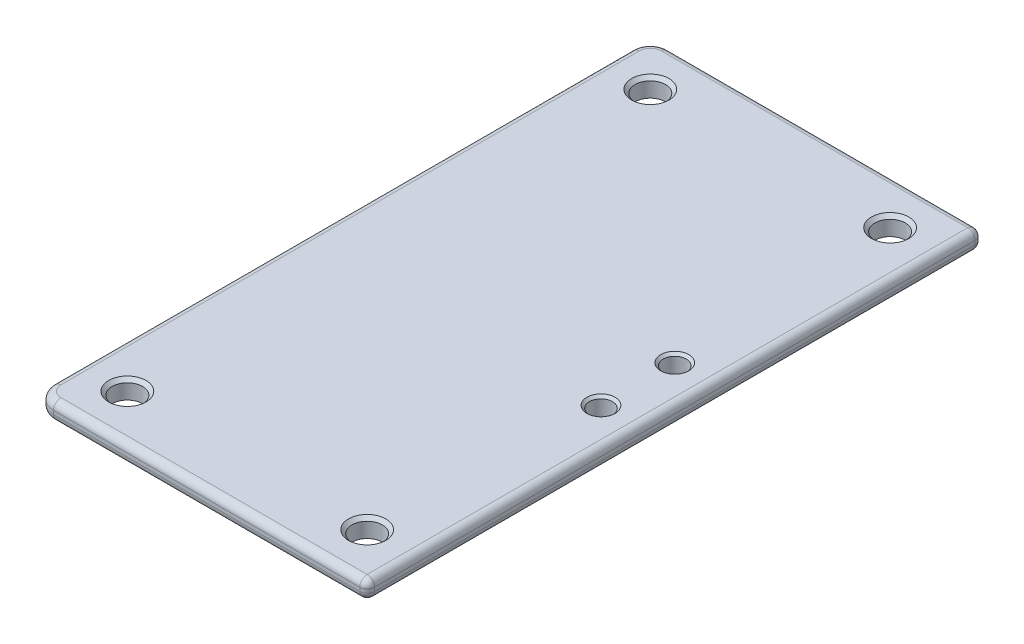
ISO-10303-21;
HEADER;
FILE_DESCRIPTION(('STEP AP214'),'2;1');
FILE_NAME('part.step','',(''),(''),'','','');
FILE_SCHEMA(('AUTOMOTIVE_DESIGN { 1 0 10303 214 1 1 1 1 }'));
ENDSEC;
DATA;
#1=APPLICATION_CONTEXT('core data for automotive mechanical design processes');
#2=APPLICATION_PROTOCOL_DEFINITION('international standard','automotive_design',2000,#1);
#3=PRODUCT_CONTEXT('',#1,'mechanical');
#4=PRODUCT('Part','Part','',(#3));
#5=PRODUCT_RELATED_PRODUCT_CATEGORY('part','',(#4));
#6=PRODUCT_DEFINITION_FORMATION('','',#4);
#7=PRODUCT_DEFINITION_CONTEXT('part definition',#1,'design');
#8=PRODUCT_DEFINITION('design','',#6,#7);
#9=PRODUCT_DEFINITION_SHAPE('','',#8);
#10=(LENGTH_UNIT() NAMED_UNIT(*) SI_UNIT(.MILLI.,.METRE.));
#11=(NAMED_UNIT(*) PLANE_ANGLE_UNIT() SI_UNIT($,.RADIAN.));
#12=(NAMED_UNIT(*) SI_UNIT($,.STERADIAN.) SOLID_ANGLE_UNIT());
#13=UNCERTAINTY_MEASURE_WITH_UNIT(LENGTH_MEASURE(1.E-05),#10,'distance_accuracy_value','');
#14=(GEOMETRIC_REPRESENTATION_CONTEXT(3) GLOBAL_UNCERTAINTY_ASSIGNED_CONTEXT((#13)) GLOBAL_UNIT_ASSIGNED_CONTEXT((#10,
#11,#12)) REPRESENTATION_CONTEXT('',''));
#15=CARTESIAN_POINT('',(0.,0.,0.));
#16=DIRECTION('',(0.,0.,1.));
#17=DIRECTION('',(1.,0.,0.));
#18=AXIS2_PLACEMENT_3D('',#15,#16,#17);
#19=CARTESIAN_POINT('',(-18.,2.,33.35));
#20=DIRECTION('',(0.,0.,-1.));
#21=DIRECTION('',(-1.,0.,0.));
#22=AXIS2_PLACEMENT_3D('',#19,#20,#21);
#23=PLANE('',#22);
#24=DIRECTION('',(0.,-1.,0.));
#25=VECTOR('',#24,1.);
#26=CARTESIAN_POINT('',(-16.,0.,33.35));
#27=LINE('',#26,#25);
#28=CARTESIAN_POINT('',(-16.,1.2,33.35));
#29=VERTEX_POINT('',#28);
#30=CARTESIAN_POINT('',(-16.,0.8,33.35));
#31=VERTEX_POINT('',#30);
#32=EDGE_CURVE('E330',#29,#31,#27,.T.);
#33=ORIENTED_EDGE('',*,*,#32,.T.);
#34=DIRECTION('',(1.,0.,0.));
#35=VECTOR('',#34,1.);
#36=CARTESIAN_POINT('',(-18.,0.8,33.35));
#37=LINE('',#36,#35);
#38=CARTESIAN_POINT('',(17.2,0.8,33.35));
#39=VERTEX_POINT('',#38);
#40=EDGE_CURVE('E218',#31,#39,#37,.T.);
#41=ORIENTED_EDGE('',*,*,#40,.T.);
#42=DIRECTION('',(0.,-1.,0.));
#43=VECTOR('',#42,1.);
#44=CARTESIAN_POINT('',(17.2,2.,33.35));
#45=LINE('',#44,#43);
#46=CARTESIAN_POINT('',(17.2,1.2,33.35));
#47=VERTEX_POINT('',#46);
#48=EDGE_CURVE('E214',#39,#47,#45,.F.);
#49=ORIENTED_EDGE('',*,*,#48,.T.);
#50=DIRECTION('',(1.,0.,0.));
#51=VECTOR('',#50,1.);
#52=CARTESIAN_POINT('',(-16.,1.2,33.35));
#53=LINE('',#52,#51);
#54=EDGE_CURVE('E216',#47,#29,#53,.F.);
#55=ORIENTED_EDGE('',*,*,#54,.T.);
#56=EDGE_LOOP('',(#33,#41,#49,#55));
#57=FACE_BOUND('',#56,.T.);
#58=ADVANCED_FACE('F43',(#57),#23,.F.);
#59=CARTESIAN_POINT('',(18.,2.,33.35));
#60=DIRECTION('',(-1.,0.,0.));
#61=DIRECTION('',(0.,0.,1.));
#62=AXIS2_PLACEMENT_3D('',#59,#60,#61);
#63=PLANE('',#62);
#64=DIRECTION('',(0.,0.,-1.));
#65=VECTOR('',#64,1.);
#66=CARTESIAN_POINT('',(18.,1.2,33.35));
#67=LINE('',#66,#65);
#68=CARTESIAN_POINT('',(18.,1.2,-32.55));
#69=VERTEX_POINT('',#68);
#70=CARTESIAN_POINT('',(18.,1.2,32.55));
#71=VERTEX_POINT('',#70);
#72=EDGE_CURVE('E52',#69,#71,#67,.F.);
#73=ORIENTED_EDGE('',*,*,#72,.T.);
#74=DIRECTION('',(0.,-1.,0.));
#75=VECTOR('',#74,1.);
#76=CARTESIAN_POINT('',(18.,2.,32.55));
#77=LINE('',#76,#75);
#78=CARTESIAN_POINT('',(18.,0.8,32.55));
#79=VERTEX_POINT('',#78);
#80=EDGE_CURVE('E11',#71,#79,#77,.T.);
#81=ORIENTED_EDGE('',*,*,#80,.T.);
#82=DIRECTION('',(0.,0.,-1.));
#83=VECTOR('',#82,1.);
#84=CARTESIAN_POINT('',(18.,0.8,33.35));
#85=LINE('',#84,#83);
#86=CARTESIAN_POINT('',(18.,0.8,-32.55));
#87=VERTEX_POINT('',#86);
#88=EDGE_CURVE('E220',#79,#87,#85,.T.);
#89=ORIENTED_EDGE('',*,*,#88,.T.);
#90=DIRECTION('',(0.,-1.,0.));
#91=VECTOR('',#90,1.);
#92=CARTESIAN_POINT('',(18.,2.,-32.55));
#93=LINE('',#92,#91);
#94=EDGE_CURVE('E63',#87,#69,#93,.F.);
#95=ORIENTED_EDGE('',*,*,#94,.T.);
#96=EDGE_LOOP('',(#73,#81,#89,#95));
#97=FACE_BOUND('',#96,.T.);
#98=ADVANCED_FACE('F386',(#97),#63,.F.);
#99=CARTESIAN_POINT('',(-18.,2.,-33.35));
#100=DIRECTION('',(0.,0.,-1.));
#101=DIRECTION('',(-1.,0.,0.));
#102=AXIS2_PLACEMENT_3D('',#99,#100,#101);
#103=PLANE('',#102);
#104=DIRECTION('',(0.,-1.,0.));
#105=VECTOR('',#104,1.);
#106=CARTESIAN_POINT('',(17.2,0.,-33.35));
#107=LINE('',#106,#105);
#108=CARTESIAN_POINT('',(17.2,1.2,-33.35));
#109=VERTEX_POINT('',#108);
#110=CARTESIAN_POINT('',(17.2,0.8,-33.35));
#111=VERTEX_POINT('',#110);
#112=EDGE_CURVE('E179',#109,#111,#107,.T.);
#113=ORIENTED_EDGE('',*,*,#112,.T.);
#114=DIRECTION('',(1.,0.,0.));
#115=VECTOR('',#114,1.);
#116=CARTESIAN_POINT('',(-16.,0.8,-33.35));
#117=LINE('',#116,#115);
#118=CARTESIAN_POINT('',(-16.,0.8,-33.35));
#119=VERTEX_POINT('',#118);
#120=EDGE_CURVE('E150',#111,#119,#117,.F.);
#121=ORIENTED_EDGE('',*,*,#120,.T.);
#122=DIRECTION('',(0.,-1.,0.));
#123=VECTOR('',#122,1.);
#124=CARTESIAN_POINT('',(-16.,2.,-33.35));
#125=LINE('',#124,#123);
#126=CARTESIAN_POINT('',(-16.,1.2,-33.35));
#127=VERTEX_POINT('',#126);
#128=EDGE_CURVE('E172',#119,#127,#125,.F.);
#129=ORIENTED_EDGE('',*,*,#128,.T.);
#130=DIRECTION('',(1.,0.,0.));
#131=VECTOR('',#130,1.);
#132=CARTESIAN_POINT('',(-18.,1.2,-33.35));
#133=LINE('',#132,#131);
#134=EDGE_CURVE('E181',#127,#109,#133,.T.);
#135=ORIENTED_EDGE('',*,*,#134,.T.);
#136=EDGE_LOOP('',(#113,#121,#129,#135));
#137=FACE_BOUND('',#136,.T.);
#138=ADVANCED_FACE('F357',(#137),#103,.T.);
#139=CARTESIAN_POINT('',(-18.,2.,33.35));
#140=DIRECTION('',(-1.,0.,0.));
#141=DIRECTION('',(0.,0.,1.));
#142=AXIS2_PLACEMENT_3D('',#139,#140,#141);
#143=PLANE('',#142);
#144=DIRECTION('',(0.,-1.,0.));
#145=VECTOR('',#144,1.);
#146=CARTESIAN_POINT('',(-18.,2.,-31.35));
#147=LINE('',#146,#145);
#148=CARTESIAN_POINT('',(-18.,1.2,-31.35));
#149=VERTEX_POINT('',#148);
#150=CARTESIAN_POINT('',(-18.,0.8,-31.35));
#151=VERTEX_POINT('',#150);
#152=EDGE_CURVE('E333',#149,#151,#147,.T.);
#153=ORIENTED_EDGE('',*,*,#152,.T.);
#154=DIRECTION('',(0.,0.,-1.));
#155=VECTOR('',#154,1.);
#156=CARTESIAN_POINT('',(-18.,0.8,31.35));
#157=LINE('',#156,#155);
#158=CARTESIAN_POINT('',(-18.,0.8,31.35));
#159=VERTEX_POINT('',#158);
#160=EDGE_CURVE('E195',#151,#159,#157,.F.);
#161=ORIENTED_EDGE('',*,*,#160,.T.);
#162=DIRECTION('',(0.,-1.,0.));
#163=VECTOR('',#162,1.);
#164=CARTESIAN_POINT('',(-18.,2.,31.35));
#165=LINE('',#164,#163);
#166=CARTESIAN_POINT('',(-18.,1.2,31.35));
#167=VERTEX_POINT('',#166);
#168=EDGE_CURVE('E336',#159,#167,#165,.F.);
#169=ORIENTED_EDGE('',*,*,#168,.T.);
#170=DIRECTION('',(0.,0.,-1.));
#171=VECTOR('',#170,1.);
#172=CARTESIAN_POINT('',(-18.,1.2,33.35));
#173=LINE('',#172,#171);
#174=EDGE_CURVE('E193',#167,#149,#173,.T.);
#175=ORIENTED_EDGE('',*,*,#174,.T.);
#176=EDGE_LOOP('',(#153,#161,#169,#175));
#177=FACE_BOUND('',#176,.T.);
#178=ADVANCED_FACE('F680',(#177),#143,.T.);
#179=CARTESIAN_POINT('',(0.,2.,0.));
#180=DIRECTION('',(0.,1.,0.));
#181=DIRECTION('',(0.,0.,1.));
#182=AXIS2_PLACEMENT_3D('',#179,#180,#181);
#183=PLANE('',#182);
#184=DIRECTION('',(0.,0.,-1.));
#185=VECTOR('',#184,1.);
#186=CARTESIAN_POINT('',(17.2,2.,-33.35));
#187=LINE('',#186,#185);
#188=CARTESIAN_POINT('',(17.2,2.,32.55));
#189=VERTEX_POINT('',#188);
#190=CARTESIAN_POINT('',(17.2,2.,-32.55));
#191=VERTEX_POINT('',#190);
#192=EDGE_CURVE('E201',#189,#191,#187,.T.);
#193=ORIENTED_EDGE('',*,*,#192,.T.);
#194=DIRECTION('',(1.,0.,0.));
#195=VECTOR('',#194,1.);
#196=CARTESIAN_POINT('',(0.,2.,-32.55));
#197=LINE('',#196,#195);
#198=CARTESIAN_POINT('',(-16.,2.,-32.55));
#199=VERTEX_POINT('',#198);
#200=EDGE_CURVE('E211',#191,#199,#197,.F.);
#201=ORIENTED_EDGE('',*,*,#200,.T.);
#202=CARTESIAN_POINT('',(-16.,2.,-31.35));
#203=DIRECTION('',(0.,1.,0.));
#204=DIRECTION('',(0.,0.,1.));
#205=AXIS2_PLACEMENT_3D('',#202,#203,#204);
#206=CIRCLE('',#205,1.2);
#207=CARTESIAN_POINT('',(-17.2,2.,-31.35));
#208=VERTEX_POINT('',#207);
#209=EDGE_CURVE('E209',#199,#208,#206,.T.);
#210=ORIENTED_EDGE('',*,*,#209,.T.);
#211=DIRECTION('',(0.,0.,-1.));
#212=VECTOR('',#211,1.);
#213=CARTESIAN_POINT('',(-17.2,2.,0.));
#214=LINE('',#213,#212);
#215=CARTESIAN_POINT('',(-17.2,2.,31.35));
#216=VERTEX_POINT('',#215);
#217=EDGE_CURVE('E207',#208,#216,#214,.F.);
#218=ORIENTED_EDGE('',*,*,#217,.T.);
#219=CARTESIAN_POINT('',(-16.,2.,31.35));
#220=DIRECTION('',(0.,1.,0.));
#221=DIRECTION('',(0.,0.,1.));
#222=AXIS2_PLACEMENT_3D('',#219,#220,#221);
#223=CIRCLE('',#222,1.2);
#224=CARTESIAN_POINT('',(-16.,2.,32.55));
#225=VERTEX_POINT('',#224);
#226=EDGE_CURVE('E205',#216,#225,#223,.T.);
#227=ORIENTED_EDGE('',*,*,#226,.T.);
#228=DIRECTION('',(1.,0.,0.));
#229=VECTOR('',#228,1.);
#230=CARTESIAN_POINT('',(18.,2.,32.55));
#231=LINE('',#230,#229);
#232=EDGE_CURVE('E203',#225,#189,#231,.T.);
#233=ORIENTED_EDGE('',*,*,#232,.T.);
#234=EDGE_LOOP('',(#193,#201,#210,#218,#227,#233));
#235=FACE_BOUND('',#234,.T.);
#236=CARTESIAN_POINT('',(14.,2.,-4.));
#237=DIRECTION('',(0.,1.,0.));
#238=DIRECTION('',(0.,0.,1.));
#239=AXIS2_PLACEMENT_3D('',#236,#237,#238);
#240=CIRCLE('',#239,1.525);
#241=CARTESIAN_POINT('',(14.,2.,-2.475));
#242=VERTEX_POINT('',#241);
#243=EDGE_CURVE('E269',#242,#242,#240,.T.);
#244=ORIENTED_EDGE('',*,*,#243,.F.);
#245=EDGE_LOOP('',(#244));
#246=FACE_BOUND('',#245,.T.);
#247=CARTESIAN_POINT('',(14.,2.,4.));
#248=DIRECTION('',(0.,1.,0.));
#249=DIRECTION('',(0.,0.,1.));
#250=AXIS2_PLACEMENT_3D('',#247,#248,#249);
#251=CIRCLE('',#250,1.525);
#252=CARTESIAN_POINT('',(14.,2.,5.525));
#253=VERTEX_POINT('',#252);
#254=EDGE_CURVE('E285',#253,#253,#251,.T.);
#255=ORIENTED_EDGE('',*,*,#254,.F.);
#256=EDGE_LOOP('',(#255));
#257=FACE_BOUND('',#256,.T.);
#258=CARTESIAN_POINT('',(-13.,2.,-28.35));
#259=DIRECTION('',(0.,1.,0.));
#260=DIRECTION('',(0.,0.,1.));
#261=AXIS2_PLACEMENT_3D('',#258,#259,#260);
#262=CIRCLE('',#261,2.025);
#263=CARTESIAN_POINT('',(-13.,2.,-26.325));
#264=VERTEX_POINT('',#263);
#265=EDGE_CURVE('E294',#264,#264,#262,.T.);
#266=ORIENTED_EDGE('',*,*,#265,.F.);
#267=EDGE_LOOP('',(#266));
#268=FACE_BOUND('',#267,.T.);
#269=CARTESIAN_POINT('',(13.,2.,-28.35));
#270=DIRECTION('',(0.,1.,0.));
#271=DIRECTION('',(0.,0.,1.));
#272=AXIS2_PLACEMENT_3D('',#269,#270,#271);
#273=CIRCLE('',#272,2.025);
#274=CARTESIAN_POINT('',(13.,2.,-26.325));
#275=VERTEX_POINT('',#274);
#276=EDGE_CURVE('E303',#275,#275,#273,.T.);
#277=ORIENTED_EDGE('',*,*,#276,.F.);
#278=EDGE_LOOP('',(#277));
#279=FACE_BOUND('',#278,.T.);
#280=CARTESIAN_POINT('',(13.,2.,28.35));
#281=DIRECTION('',(0.,1.,0.));
#282=DIRECTION('',(0.,0.,1.));
#283=AXIS2_PLACEMENT_3D('',#280,#281,#282);
#284=CIRCLE('',#283,2.025);
#285=CARTESIAN_POINT('',(13.,2.,30.375));
#286=VERTEX_POINT('',#285);
#287=EDGE_CURVE('E312',#286,#286,#284,.T.);
#288=ORIENTED_EDGE('',*,*,#287,.F.);
#289=EDGE_LOOP('',(#288));
#290=FACE_BOUND('',#289,.T.);
#291=CARTESIAN_POINT('',(-13.,2.,28.35));
#292=DIRECTION('',(0.,1.,0.));
#293=DIRECTION('',(0.,0.,1.));
#294=AXIS2_PLACEMENT_3D('',#291,#292,#293);
#295=CIRCLE('',#294,2.025);
#296=CARTESIAN_POINT('',(-13.,2.,30.375));
#297=VERTEX_POINT('',#296);
#298=EDGE_CURVE('E321',#297,#297,#295,.T.);
#299=ORIENTED_EDGE('',*,*,#298,.F.);
#300=EDGE_LOOP('',(#299));
#301=FACE_BOUND('',#300,.T.);
#302=ADVANCED_FACE('F672',(#235,#246,#257,#268,#279,#290,#301),#183,.T.);
#303=CARTESIAN_POINT('',(0.,0.,0.));
#304=DIRECTION('',(0.,1.,0.));
#305=DIRECTION('',(0.,0.,1.));
#306=AXIS2_PLACEMENT_3D('',#303,#304,#305);
#307=PLANE('',#306);
#308=CARTESIAN_POINT('',(-16.,0.,-31.35));
#309=DIRECTION('',(0.,1.,0.));
#310=DIRECTION('',(0.,0.,1.));
#311=AXIS2_PLACEMENT_3D('',#308,#309,#310);
#312=CIRCLE('',#311,1.2);
#313=CARTESIAN_POINT('',(-17.2,0.,-31.35));
#314=VERTEX_POINT('',#313);
#315=CARTESIAN_POINT('',(-16.,0.,-32.55));
#316=VERTEX_POINT('',#315);
#317=EDGE_CURVE('E177',#314,#316,#312,.F.);
#318=ORIENTED_EDGE('',*,*,#317,.T.);
#319=DIRECTION('',(1.,0.,0.));
#320=VECTOR('',#319,1.);
#321=CARTESIAN_POINT('',(18.,0.,-32.55));
#322=LINE('',#321,#320);
#323=CARTESIAN_POINT('',(17.2,0.,-32.55));
#324=VERTEX_POINT('',#323);
#325=EDGE_CURVE('E148',#316,#324,#322,.T.);
#326=ORIENTED_EDGE('',*,*,#325,.T.);
#327=DIRECTION('',(0.,0.,-1.));
#328=VECTOR('',#327,1.);
#329=CARTESIAN_POINT('',(17.2,0.,0.));
#330=LINE('',#329,#328);
#331=CARTESIAN_POINT('',(17.2,0.,32.55));
#332=VERTEX_POINT('',#331);
#333=EDGE_CURVE('E165',#324,#332,#330,.F.);
#334=ORIENTED_EDGE('',*,*,#333,.T.);
#335=DIRECTION('',(1.,0.,0.));
#336=VECTOR('',#335,1.);
#337=CARTESIAN_POINT('',(0.,0.,32.55));
#338=LINE('',#337,#336);
#339=CARTESIAN_POINT('',(-16.,0.,32.55));
#340=VERTEX_POINT('',#339);
#341=EDGE_CURVE('E171',#332,#340,#338,.F.);
#342=ORIENTED_EDGE('',*,*,#341,.T.);
#343=CARTESIAN_POINT('',(-16.,0.,31.35));
#344=DIRECTION('',(0.,1.,0.));
#345=DIRECTION('',(0.,0.,1.));
#346=AXIS2_PLACEMENT_3D('',#343,#344,#345);
#347=CIRCLE('',#346,1.2);
#348=CARTESIAN_POINT('',(-17.2,0.,31.35));
#349=VERTEX_POINT('',#348);
#350=EDGE_CURVE('E342',#340,#349,#347,.F.);
#351=ORIENTED_EDGE('',*,*,#350,.T.);
#352=DIRECTION('',(0.,0.,-1.));
#353=VECTOR('',#352,1.);
#354=CARTESIAN_POINT('',(-17.2,0.,-31.35));
#355=LINE('',#354,#353);
#356=EDGE_CURVE('E183',#349,#314,#355,.T.);
#357=ORIENTED_EDGE('',*,*,#356,.T.);
#358=EDGE_LOOP('',(#318,#326,#334,#342,#351,#357));
#359=FACE_BOUND('',#358,.T.);
#360=CARTESIAN_POINT('',(14.,0.,-4.));
#361=DIRECTION('',(0.,1.,0.));
#362=DIRECTION('',(0.,0.,1.));
#363=AXIS2_PLACEMENT_3D('',#360,#361,#362);
#364=CIRCLE('',#363,1.25);
#365=CARTESIAN_POINT('',(14.,0.,-2.75));
#366=VERTEX_POINT('',#365);
#367=EDGE_CURVE('E280',#366,#366,#364,.T.);
#368=ORIENTED_EDGE('',*,*,#367,.T.);
#369=EDGE_LOOP('',(#368));
#370=FACE_BOUND('',#369,.T.);
#371=CARTESIAN_POINT('',(14.,0.,4.));
#372=DIRECTION('',(0.,1.,0.));
#373=DIRECTION('',(0.,0.,1.));
#374=AXIS2_PLACEMENT_3D('',#371,#372,#373);
#375=CIRCLE('',#374,1.25);
#376=CARTESIAN_POINT('',(14.,0.,5.25));
#377=VERTEX_POINT('',#376);
#378=EDGE_CURVE('E291',#377,#377,#375,.T.);
#379=ORIENTED_EDGE('',*,*,#378,.T.);
#380=EDGE_LOOP('',(#379));
#381=FACE_BOUND('',#380,.T.);
#382=CARTESIAN_POINT('',(-13.,0.,-28.35));
#383=DIRECTION('',(0.,1.,0.));
#384=DIRECTION('',(0.,0.,1.));
#385=AXIS2_PLACEMENT_3D('',#382,#383,#384);
#386=CIRCLE('',#385,1.64999999999999);
#387=CARTESIAN_POINT('',(-13.,0.,-26.7));
#388=VERTEX_POINT('',#387);
#389=EDGE_CURVE('E300',#388,#388,#386,.T.);
#390=ORIENTED_EDGE('',*,*,#389,.T.);
#391=EDGE_LOOP('',(#390));
#392=FACE_BOUND('',#391,.T.);
#393=CARTESIAN_POINT('',(13.,0.,-28.35));
#394=DIRECTION('',(0.,1.,0.));
#395=DIRECTION('',(0.,0.,1.));
#396=AXIS2_PLACEMENT_3D('',#393,#394,#395);
#397=CIRCLE('',#396,1.64999999999999);
#398=CARTESIAN_POINT('',(13.,0.,-26.7));
#399=VERTEX_POINT('',#398);
#400=EDGE_CURVE('E309',#399,#399,#397,.T.);
#401=ORIENTED_EDGE('',*,*,#400,.T.);
#402=EDGE_LOOP('',(#401));
#403=FACE_BOUND('',#402,.T.);
#404=CARTESIAN_POINT('',(13.,0.,28.35));
#405=DIRECTION('',(0.,1.,0.));
#406=DIRECTION('',(0.,0.,1.));
#407=AXIS2_PLACEMENT_3D('',#404,#405,#406);
#408=CIRCLE('',#407,1.64999999999999);
#409=CARTESIAN_POINT('',(13.,0.,30.));
#410=VERTEX_POINT('',#409);
#411=EDGE_CURVE('E318',#410,#410,#408,.T.);
#412=ORIENTED_EDGE('',*,*,#411,.T.);
#413=EDGE_LOOP('',(#412));
#414=FACE_BOUND('',#413,.T.);
#415=CARTESIAN_POINT('',(-13.,0.,28.35));
#416=DIRECTION('',(0.,1.,0.));
#417=DIRECTION('',(0.,0.,1.));
#418=AXIS2_PLACEMENT_3D('',#415,#416,#417);
#419=CIRCLE('',#418,1.64999999999999);
#420=CARTESIAN_POINT('',(-13.,0.,30.));
#421=VERTEX_POINT('',#420);
#422=EDGE_CURVE('E327',#421,#421,#419,.T.);
#423=ORIENTED_EDGE('',*,*,#422,.T.);
#424=EDGE_LOOP('',(#423));
#425=FACE_BOUND('',#424,.T.);
#426=ADVANCED_FACE('F174',(#359,#370,#381,#392,#403,#414,#425),#307,.F.);
#427=CARTESIAN_POINT('',(-13.,2.,28.35));
#428=DIRECTION('',(0.,1.,0.));
#429=DIRECTION('',(0.,0.,1.));
#430=AXIS2_PLACEMENT_3D('',#427,#428,#429);
#431=CYLINDRICAL_SURFACE('',#430,1.64999999999999);
#432=ORIENTED_EDGE('',*,*,#422,.F.);
#433=EDGE_LOOP('',(#432));
#434=FACE_BOUND('',#433,.T.);
#435=CARTESIAN_POINT('',(-13.,1.625,28.35));
#436=DIRECTION('',(0.,1.,0.));
#437=DIRECTION('',(0.,0.,1.));
#438=AXIS2_PLACEMENT_3D('',#435,#436,#437);
#439=CIRCLE('',#438,1.64999999999999);
#440=CARTESIAN_POINT('',(-13.,1.625,30.));
#441=VERTEX_POINT('',#440);
#442=EDGE_CURVE('E324',#441,#441,#439,.T.);
#443=ORIENTED_EDGE('',*,*,#442,.T.);
#444=EDGE_LOOP('',(#443));
#445=FACE_BOUND('',#444,.T.);
#446=ADVANCED_FACE('F654',(#434,#445),#431,.F.);
#447=CARTESIAN_POINT('',(-13.,2.,28.35));
#448=DIRECTION('',(0.,1.,0.));
#449=DIRECTION('',(0.,0.,1.));
#450=AXIS2_PLACEMENT_3D('',#447,#448,#449);
#451=CONICAL_SURFACE('',#450,2.025,0.78539816339746);
#452=ORIENTED_EDGE('',*,*,#442,.F.);
#453=EDGE_LOOP('',(#452));
#454=FACE_BOUND('',#453,.T.);
#455=ORIENTED_EDGE('',*,*,#298,.T.);
#456=EDGE_LOOP('',(#455));
#457=FACE_BOUND('',#456,.T.);
#458=ADVANCED_FACE('F644',(#454,#457),#451,.F.);
#459=CARTESIAN_POINT('',(13.,2.,28.35));
#460=DIRECTION('',(0.,1.,0.));
#461=DIRECTION('',(0.,0.,1.));
#462=AXIS2_PLACEMENT_3D('',#459,#460,#461);
#463=CYLINDRICAL_SURFACE('',#462,1.64999999999999);
#464=ORIENTED_EDGE('',*,*,#411,.F.);
#465=EDGE_LOOP('',(#464));
#466=FACE_BOUND('',#465,.T.);
#467=CARTESIAN_POINT('',(13.,1.625,28.35));
#468=DIRECTION('',(0.,1.,0.));
#469=DIRECTION('',(0.,0.,1.));
#470=AXIS2_PLACEMENT_3D('',#467,#468,#469);
#471=CIRCLE('',#470,1.64999999999999);
#472=CARTESIAN_POINT('',(13.,1.625,30.));
#473=VERTEX_POINT('',#472);
#474=EDGE_CURVE('E315',#473,#473,#471,.T.);
#475=ORIENTED_EDGE('',*,*,#474,.T.);
#476=EDGE_LOOP('',(#475));
#477=FACE_BOUND('',#476,.T.);
#478=ADVANCED_FACE('F635',(#466,#477),#463,.F.);
#479=CARTESIAN_POINT('',(13.,2.,28.35));
#480=DIRECTION('',(0.,1.,0.));
#481=DIRECTION('',(0.,0.,1.));
#482=AXIS2_PLACEMENT_3D('',#479,#480,#481);
#483=CONICAL_SURFACE('',#482,2.025,0.78539816339746);
#484=ORIENTED_EDGE('',*,*,#474,.F.);
#485=EDGE_LOOP('',(#484));
#486=FACE_BOUND('',#485,.T.);
#487=ORIENTED_EDGE('',*,*,#287,.T.);
#488=EDGE_LOOP('',(#487));
#489=FACE_BOUND('',#488,.T.);
#490=ADVANCED_FACE('F625',(#486,#489),#483,.F.);
#491=CARTESIAN_POINT('',(13.,2.,-28.35));
#492=DIRECTION('',(0.,1.,0.));
#493=DIRECTION('',(0.,0.,1.));
#494=AXIS2_PLACEMENT_3D('',#491,#492,#493);
#495=CYLINDRICAL_SURFACE('',#494,1.64999999999999);
#496=ORIENTED_EDGE('',*,*,#400,.F.);
#497=EDGE_LOOP('',(#496));
#498=FACE_BOUND('',#497,.T.);
#499=CARTESIAN_POINT('',(13.,1.625,-28.35));
#500=DIRECTION('',(0.,1.,0.));
#501=DIRECTION('',(0.,0.,1.));
#502=AXIS2_PLACEMENT_3D('',#499,#500,#501);
#503=CIRCLE('',#502,1.64999999999999);
#504=CARTESIAN_POINT('',(13.,1.625,-26.7));
#505=VERTEX_POINT('',#504);
#506=EDGE_CURVE('E306',#505,#505,#503,.T.);
#507=ORIENTED_EDGE('',*,*,#506,.T.);
#508=EDGE_LOOP('',(#507));
#509=FACE_BOUND('',#508,.T.);
#510=ADVANCED_FACE('F616',(#498,#509),#495,.F.);
#511=CARTESIAN_POINT('',(13.,2.,-28.35));
#512=DIRECTION('',(0.,1.,0.));
#513=DIRECTION('',(0.,0.,1.));
#514=AXIS2_PLACEMENT_3D('',#511,#512,#513);
#515=CONICAL_SURFACE('',#514,2.025,0.78539816339746);
#516=ORIENTED_EDGE('',*,*,#506,.F.);
#517=EDGE_LOOP('',(#516));
#518=FACE_BOUND('',#517,.T.);
#519=ORIENTED_EDGE('',*,*,#276,.T.);
#520=EDGE_LOOP('',(#519));
#521=FACE_BOUND('',#520,.T.);
#522=ADVANCED_FACE('F606',(#518,#521),#515,.F.);
#523=CARTESIAN_POINT('',(-13.,2.,-28.35));
#524=DIRECTION('',(0.,1.,0.));
#525=DIRECTION('',(0.,0.,1.));
#526=AXIS2_PLACEMENT_3D('',#523,#524,#525);
#527=CYLINDRICAL_SURFACE('',#526,1.64999999999999);
#528=ORIENTED_EDGE('',*,*,#389,.F.);
#529=EDGE_LOOP('',(#528));
#530=FACE_BOUND('',#529,.T.);
#531=CARTESIAN_POINT('',(-13.,1.625,-28.35));
#532=DIRECTION('',(0.,1.,0.));
#533=DIRECTION('',(0.,0.,1.));
#534=AXIS2_PLACEMENT_3D('',#531,#532,#533);
#535=CIRCLE('',#534,1.64999999999999);
#536=CARTESIAN_POINT('',(-13.,1.625,-26.7));
#537=VERTEX_POINT('',#536);
#538=EDGE_CURVE('E297',#537,#537,#535,.T.);
#539=ORIENTED_EDGE('',*,*,#538,.T.);
#540=EDGE_LOOP('',(#539));
#541=FACE_BOUND('',#540,.T.);
#542=ADVANCED_FACE('F597',(#530,#541),#527,.F.);
#543=CARTESIAN_POINT('',(-13.,2.,-28.35));
#544=DIRECTION('',(0.,1.,0.));
#545=DIRECTION('',(0.,0.,1.));
#546=AXIS2_PLACEMENT_3D('',#543,#544,#545);
#547=CONICAL_SURFACE('',#546,2.025,0.78539816339746);
#548=ORIENTED_EDGE('',*,*,#538,.F.);
#549=EDGE_LOOP('',(#548));
#550=FACE_BOUND('',#549,.T.);
#551=ORIENTED_EDGE('',*,*,#265,.T.);
#552=EDGE_LOOP('',(#551));
#553=FACE_BOUND('',#552,.T.);
#554=ADVANCED_FACE('F399',(#550,#553),#547,.F.);
#555=CARTESIAN_POINT('',(-16.,2.,31.35));
#556=DIRECTION('',(0.,1.,0.));
#557=DIRECTION('',(0.,0.,1.));
#558=AXIS2_PLACEMENT_3D('',#555,#556,#557);
#559=CYLINDRICAL_SURFACE('',#558,2.);
#560=ORIENTED_EDGE('',*,*,#168,.F.);
#561=CARTESIAN_POINT('',(-16.,0.8,31.35));
#562=DIRECTION('',(0.,1.,0.));
#563=DIRECTION('',(0.,0.,1.));
#564=AXIS2_PLACEMENT_3D('',#561,#562,#563);
#565=CIRCLE('',#564,2.);
#566=EDGE_CURVE('E199',#159,#31,#565,.T.);
#567=ORIENTED_EDGE('',*,*,#566,.T.);
#568=ORIENTED_EDGE('',*,*,#32,.F.);
#569=CARTESIAN_POINT('',(-16.,1.2,31.35));
#570=DIRECTION('',(0.,1.,0.));
#571=DIRECTION('',(0.,0.,1.));
#572=AXIS2_PLACEMENT_3D('',#569,#570,#571);
#573=CIRCLE('',#572,2.);
#574=EDGE_CURVE('E197',#29,#167,#573,.F.);
#575=ORIENTED_EDGE('',*,*,#574,.T.);
#576=EDGE_LOOP('',(#560,#567,#568,#575));
#577=FACE_BOUND('',#576,.T.);
#578=ADVANCED_FACE('F396',(#577),#559,.T.);
#579=CARTESIAN_POINT('',(-16.,2.,-31.35));
#580=DIRECTION('',(0.,-1.,0.));
#581=DIRECTION('',(0.,0.,-1.));
#582=AXIS2_PLACEMENT_3D('',#579,#580,#581);
#583=CYLINDRICAL_SURFACE('',#582,2.);
#584=ORIENTED_EDGE('',*,*,#128,.F.);
#585=CARTESIAN_POINT('',(-16.,0.8,-31.35));
#586=DIRECTION('',(0.,1.,0.));
#587=DIRECTION('',(0.,0.,1.));
#588=AXIS2_PLACEMENT_3D('',#585,#586,#587);
#589=CIRCLE('',#588,2.);
#590=EDGE_CURVE('E191',#119,#151,#589,.T.);
#591=ORIENTED_EDGE('',*,*,#590,.T.);
#592=ORIENTED_EDGE('',*,*,#152,.F.);
#593=CARTESIAN_POINT('',(-16.,1.2,-31.35));
#594=DIRECTION('',(0.,1.,0.));
#595=DIRECTION('',(0.,0.,1.));
#596=AXIS2_PLACEMENT_3D('',#593,#594,#595);
#597=CIRCLE('',#596,2.);
#598=EDGE_CURVE('E189',#149,#127,#597,.F.);
#599=ORIENTED_EDGE('',*,*,#598,.T.);
#600=EDGE_LOOP('',(#584,#591,#592,#599));
#601=FACE_BOUND('',#600,.T.);
#602=ADVANCED_FACE('F360',(#601),#583,.T.);
#603=CARTESIAN_POINT('',(14.,2.,4.));
#604=DIRECTION('',(0.,1.,0.));
#605=DIRECTION('',(0.,0.,1.));
#606=AXIS2_PLACEMENT_3D('',#603,#604,#605);
#607=CYLINDRICAL_SURFACE('',#606,1.25);
#608=ORIENTED_EDGE('',*,*,#378,.F.);
#609=EDGE_LOOP('',(#608));
#610=FACE_BOUND('',#609,.T.);
#611=CARTESIAN_POINT('',(14.,1.725,4.));
#612=DIRECTION('',(0.,1.,0.));
#613=DIRECTION('',(0.,0.,1.));
#614=AXIS2_PLACEMENT_3D('',#611,#612,#613);
#615=CIRCLE('',#614,1.25);
#616=CARTESIAN_POINT('',(14.,1.725,5.25));
#617=VERTEX_POINT('',#616);
#618=EDGE_CURVE('E288',#617,#617,#615,.T.);
#619=ORIENTED_EDGE('',*,*,#618,.T.);
#620=EDGE_LOOP('',(#619));
#621=FACE_BOUND('',#620,.T.);
#622=ADVANCED_FACE('F403',(#610,#621),#607,.F.);
#623=CARTESIAN_POINT('',(14.,2.,4.));
#624=DIRECTION('',(0.,1.,0.));
#625=DIRECTION('',(0.,0.,1.));
#626=AXIS2_PLACEMENT_3D('',#623,#624,#625);
#627=CONICAL_SURFACE('',#626,1.525,0.78539816339745);
#628=ORIENTED_EDGE('',*,*,#618,.F.);
#629=EDGE_LOOP('',(#628));
#630=FACE_BOUND('',#629,.T.);
#631=ORIENTED_EDGE('',*,*,#254,.T.);
#632=EDGE_LOOP('',(#631));
#633=FACE_BOUND('',#632,.T.);
#634=ADVANCED_FACE('F560',(#630,#633),#627,.F.);
#635=CARTESIAN_POINT('',(14.,2.,-4.));
#636=DIRECTION('',(0.,1.,0.));
#637=DIRECTION('',(0.,0.,1.));
#638=AXIS2_PLACEMENT_3D('',#635,#636,#637);
#639=CYLINDRICAL_SURFACE('',#638,1.25);
#640=ORIENTED_EDGE('',*,*,#367,.F.);
#641=EDGE_LOOP('',(#640));
#642=FACE_BOUND('',#641,.T.);
#643=CARTESIAN_POINT('',(14.,1.725,-4.));
#644=DIRECTION('',(0.,1.,0.));
#645=DIRECTION('',(0.,0.,1.));
#646=AXIS2_PLACEMENT_3D('',#643,#644,#645);
#647=CIRCLE('',#646,1.25);
#648=CARTESIAN_POINT('',(14.,1.725,-2.75));
#649=VERTEX_POINT('',#648);
#650=EDGE_CURVE('E275',#649,#649,#647,.T.);
#651=ORIENTED_EDGE('',*,*,#650,.T.);
#652=EDGE_LOOP('',(#651));
#653=FACE_BOUND('',#652,.T.);
#654=ADVANCED_FACE('F551',(#642,#653),#639,.F.);
#655=CARTESIAN_POINT('',(14.,2.,-4.));
#656=DIRECTION('',(0.,1.,0.));
#657=DIRECTION('',(0.,0.,1.));
#658=AXIS2_PLACEMENT_3D('',#655,#656,#657);
#659=CONICAL_SURFACE('',#658,1.525,0.78539816339745);
#660=ORIENTED_EDGE('',*,*,#650,.F.);
#661=EDGE_LOOP('',(#660));
#662=FACE_BOUND('',#661,.T.);
#663=ORIENTED_EDGE('',*,*,#243,.T.);
#664=EDGE_LOOP('',(#663));
#665=FACE_BOUND('',#664,.T.);
#666=ADVANCED_FACE('F543',(#662,#665),#659,.F.);
#667=CARTESIAN_POINT('',(-16.,1.2,31.35));
#668=DIRECTION('',(0.,1.,0.));
#669=DIRECTION('',(0.,0.,1.));
#670=AXIS2_PLACEMENT_3D('',#667,#668,#669);
#671=TOROIDAL_SURFACE('',#670,1.2,0.8);
#672=CARTESIAN_POINT('',(-17.2,1.2,31.35));
#673=DIRECTION('',(0.,0.,-1.));
#674=DIRECTION('',(-1.,0.,0.));
#675=AXIS2_PLACEMENT_3D('',#672,#673,#674);
#676=CIRCLE('',#675,0.8);
#677=EDGE_CURVE('E262',#167,#216,#676,.T.);
#678=ORIENTED_EDGE('',*,*,#677,.F.);
#679=ORIENTED_EDGE('',*,*,#574,.F.);
#680=CARTESIAN_POINT('',(-16.,1.2,32.55));
#681=DIRECTION('',(1.,0.,0.));
#682=DIRECTION('',(0.,0.,-1.));
#683=AXIS2_PLACEMENT_3D('',#680,#681,#682);
#684=CIRCLE('',#683,0.8);
#685=EDGE_CURVE('E47',#225,#29,#684,.T.);
#686=ORIENTED_EDGE('',*,*,#685,.F.);
#687=ORIENTED_EDGE('',*,*,#226,.F.);
#688=EDGE_LOOP('',(#678,#679,#686,#687));
#689=FACE_BOUND('',#688,.T.);
#690=ADVANCED_FACE('F45',(#689),#671,.T.);
#691=CARTESIAN_POINT('',(0.,1.2,32.55));
#692=DIRECTION('',(-1.,0.,0.));
#693=DIRECTION('',(0.,0.,1.));
#694=AXIS2_PLACEMENT_3D('',#691,#692,#693);
#695=CYLINDRICAL_SURFACE('',#694,0.8);
#696=ORIENTED_EDGE('',*,*,#685,.T.);
#697=ORIENTED_EDGE('',*,*,#54,.F.);
#698=CARTESIAN_POINT('',(17.2,1.2,32.55));
#699=DIRECTION('',(1.,0.,0.));
#700=DIRECTION('',(0.,0.,-1.));
#701=AXIS2_PLACEMENT_3D('',#698,#699,#700);
#702=CIRCLE('',#701,0.8);
#703=EDGE_CURVE('E260',#189,#47,#702,.T.);
#704=ORIENTED_EDGE('',*,*,#703,.F.);
#705=ORIENTED_EDGE('',*,*,#232,.F.);
#706=EDGE_LOOP('',(#696,#697,#704,#705));
#707=FACE_BOUND('',#706,.T.);
#708=ADVANCED_FACE('F529',(#707),#695,.T.);
#709=CARTESIAN_POINT('',(-17.2,1.2,33.35));
#710=DIRECTION('',(0.,0.,-1.));
#711=DIRECTION('',(-1.,0.,0.));
#712=AXIS2_PLACEMENT_3D('',#709,#710,#711);
#713=CYLINDRICAL_SURFACE('',#712,0.8);
#714=ORIENTED_EDGE('',*,*,#677,.T.);
#715=ORIENTED_EDGE('',*,*,#217,.F.);
#716=CARTESIAN_POINT('',(-17.2,1.2,-31.35));
#717=DIRECTION('',(0.,0.,-1.));
#718=DIRECTION('',(-1.,0.,0.));
#719=AXIS2_PLACEMENT_3D('',#716,#717,#718);
#720=CIRCLE('',#719,0.8);
#721=EDGE_CURVE('E257',#149,#208,#720,.T.);
#722=ORIENTED_EDGE('',*,*,#721,.F.);
#723=ORIENTED_EDGE('',*,*,#174,.F.);
#724=EDGE_LOOP('',(#714,#715,#722,#723));
#725=FACE_BOUND('',#724,.T.);
#726=ADVANCED_FACE('F520',(#725),#713,.T.);
#727=CARTESIAN_POINT('',(17.2,1.2,32.55));
#728=DIRECTION('',(0.,0.,1.));
#729=DIRECTION('',(1.,0.,0.));
#730=AXIS2_PLACEMENT_3D('',#727,#728,#729);
#731=SPHERICAL_SURFACE('',#730,0.8);
#732=CARTESIAN_POINT('',(17.2,1.2,32.55));
#733=DIRECTION('',(0.,0.,1.));
#734=DIRECTION('',(1.,0.,0.));
#735=AXIS2_PLACEMENT_3D('',#732,#733,#734);
#736=CIRCLE('',#735,0.8);
#737=EDGE_CURVE('E252',#189,#71,#736,.F.);
#738=ORIENTED_EDGE('',*,*,#737,.F.);
#739=ORIENTED_EDGE('',*,*,#703,.T.);
#740=CARTESIAN_POINT('',(17.2,1.2,32.55));
#741=DIRECTION('',(0.,1.,0.));
#742=DIRECTION('',(0.,0.,1.));
#743=AXIS2_PLACEMENT_3D('',#740,#741,#742);
#744=CIRCLE('',#743,0.8);
#745=EDGE_CURVE('E254',#71,#47,#744,.F.);
#746=ORIENTED_EDGE('',*,*,#745,.F.);
#747=EDGE_LOOP('',(#738,#739,#746));
#748=FACE_BOUND('',#747,.T.);
#749=ADVANCED_FACE('F510',(#748),#731,.T.);
#750=CARTESIAN_POINT('',(-16.,1.2,-31.35));
#751=DIRECTION('',(0.,1.,0.));
#752=DIRECTION('',(0.,0.,1.));
#753=AXIS2_PLACEMENT_3D('',#750,#751,#752);
#754=TOROIDAL_SURFACE('',#753,1.2,0.8);
#755=ORIENTED_EDGE('',*,*,#721,.T.);
#756=ORIENTED_EDGE('',*,*,#209,.F.);
#757=CARTESIAN_POINT('',(-16.,1.2,-32.55));
#758=DIRECTION('',(1.,0.,0.));
#759=DIRECTION('',(0.,0.,-1.));
#760=AXIS2_PLACEMENT_3D('',#757,#758,#759);
#761=CIRCLE('',#760,0.8);
#762=EDGE_CURVE('E250',#127,#199,#761,.T.);
#763=ORIENTED_EDGE('',*,*,#762,.F.);
#764=ORIENTED_EDGE('',*,*,#598,.F.);
#765=EDGE_LOOP('',(#755,#756,#763,#764));
#766=FACE_BOUND('',#765,.T.);
#767=ADVANCED_FACE('F364',(#766),#754,.T.);
#768=CARTESIAN_POINT('',(-18.,0.8,32.55));
#769=DIRECTION('',(1.,0.,0.));
#770=DIRECTION('',(0.,0.,-1.));
#771=AXIS2_PLACEMENT_3D('',#768,#769,#770);
#772=CYLINDRICAL_SURFACE('',#771,0.8);
#773=CARTESIAN_POINT('',(17.2,0.8,32.55));
#774=DIRECTION('',(1.,0.,0.));
#775=DIRECTION('',(0.,0.,-1.));
#776=AXIS2_PLACEMENT_3D('',#773,#774,#775);
#777=CIRCLE('',#776,0.8);
#778=EDGE_CURVE('E244',#39,#332,#777,.T.);
#779=ORIENTED_EDGE('',*,*,#778,.F.);
#780=ORIENTED_EDGE('',*,*,#40,.F.);
#781=CARTESIAN_POINT('',(-16.,0.8,32.55));
#782=DIRECTION('',(-1.,0.,0.));
#783=DIRECTION('',(0.,0.,1.));
#784=AXIS2_PLACEMENT_3D('',#781,#782,#783);
#785=CIRCLE('',#784,0.8);
#786=EDGE_CURVE('E247',#340,#31,#785,.T.);
#787=ORIENTED_EDGE('',*,*,#786,.F.);
#788=ORIENTED_EDGE('',*,*,#341,.F.);
#789=EDGE_LOOP('',(#779,#780,#787,#788));
#790=FACE_BOUND('',#789,.T.);
#791=ADVANCED_FACE('F493',(#790),#772,.T.);
#792=CARTESIAN_POINT('',(17.2,2.,32.55));
#793=DIRECTION('',(0.,-1.,0.));
#794=DIRECTION('',(0.,0.,-1.));
#795=AXIS2_PLACEMENT_3D('',#792,#793,#794);
#796=CYLINDRICAL_SURFACE('',#795,0.8);
#797=ORIENTED_EDGE('',*,*,#745,.T.);
#798=ORIENTED_EDGE('',*,*,#48,.F.);
#799=CARTESIAN_POINT('',(17.2,0.8,32.55));
#800=DIRECTION('',(0.,-1.,0.));
#801=DIRECTION('',(0.,0.,-1.));
#802=AXIS2_PLACEMENT_3D('',#799,#800,#801);
#803=CIRCLE('',#802,0.8);
#804=EDGE_CURVE('E241',#79,#39,#803,.T.);
#805=ORIENTED_EDGE('',*,*,#804,.F.);
#806=ORIENTED_EDGE('',*,*,#80,.F.);
#807=EDGE_LOOP('',(#797,#798,#805,#806));
#808=FACE_BOUND('',#807,.T.);
#809=ADVANCED_FACE('F484',(#808),#796,.T.);
#810=CARTESIAN_POINT('',(17.2,1.2,0.));
#811=DIRECTION('',(0.,0.,1.));
#812=DIRECTION('',(1.,0.,0.));
#813=AXIS2_PLACEMENT_3D('',#810,#811,#812);
#814=CYLINDRICAL_SURFACE('',#813,0.8);
#815=ORIENTED_EDGE('',*,*,#737,.T.);
#816=ORIENTED_EDGE('',*,*,#72,.F.);
#817=CARTESIAN_POINT('',(17.2,1.2,-32.55));
#818=DIRECTION('',(0.,0.,-1.));
#819=DIRECTION('',(-1.,0.,0.));
#820=AXIS2_PLACEMENT_3D('',#817,#818,#819);
#821=CIRCLE('',#820,0.8);
#822=EDGE_CURVE('E238',#191,#69,#821,.T.);
#823=ORIENTED_EDGE('',*,*,#822,.F.);
#824=ORIENTED_EDGE('',*,*,#192,.F.);
#825=EDGE_LOOP('',(#815,#816,#823,#824));
#826=FACE_BOUND('',#825,.T.);
#827=ADVANCED_FACE('F476',(#826),#814,.T.);
#828=CARTESIAN_POINT('',(-18.,1.2,-32.55));
#829=DIRECTION('',(1.,0.,0.));
#830=DIRECTION('',(0.,0.,-1.));
#831=AXIS2_PLACEMENT_3D('',#828,#829,#830);
#832=CYLINDRICAL_SURFACE('',#831,0.8);
#833=ORIENTED_EDGE('',*,*,#762,.T.);
#834=ORIENTED_EDGE('',*,*,#200,.F.);
#835=CARTESIAN_POINT('',(17.2,1.2,-32.55));
#836=DIRECTION('',(1.,0.,0.));
#837=DIRECTION('',(0.,1.,0.));
#838=AXIS2_PLACEMENT_3D('',#835,#836,#837);
#839=CIRCLE('',#838,0.8);
#840=EDGE_CURVE('E235',#109,#191,#839,.T.);
#841=ORIENTED_EDGE('',*,*,#840,.F.);
#842=ORIENTED_EDGE('',*,*,#134,.F.);
#843=EDGE_LOOP('',(#833,#834,#841,#842));
#844=FACE_BOUND('',#843,.T.);
#845=ADVANCED_FACE('F370',(#844),#832,.T.);
#846=CARTESIAN_POINT('',(-16.,0.8,31.35));
#847=DIRECTION('',(0.,1.,0.));
#848=DIRECTION('',(0.,0.,1.));
#849=AXIS2_PLACEMENT_3D('',#846,#847,#848);
#850=TOROIDAL_SURFACE('',#849,1.2,0.8);
#851=ORIENTED_EDGE('',*,*,#786,.T.);
#852=ORIENTED_EDGE('',*,*,#566,.F.);
#853=CARTESIAN_POINT('',(-17.2,0.8,31.35));
#854=DIRECTION('',(0.,0.,-1.));
#855=DIRECTION('',(-1.,0.,0.));
#856=AXIS2_PLACEMENT_3D('',#853,#854,#855);
#857=CIRCLE('',#856,0.8);
#858=EDGE_CURVE('E232',#349,#159,#857,.T.);
#859=ORIENTED_EDGE('',*,*,#858,.F.);
#860=ORIENTED_EDGE('',*,*,#350,.F.);
#861=EDGE_LOOP('',(#851,#852,#859,#860));
#862=FACE_BOUND('',#861,.T.);
#863=ADVANCED_FACE('F457',(#862),#850,.T.);
#864=CARTESIAN_POINT('',(17.2,0.8,32.55));
#865=DIRECTION('',(0.,0.,1.));
#866=DIRECTION('',(0.,-1.,0.));
#867=AXIS2_PLACEMENT_3D('',#864,#865,#866);
#868=SPHERICAL_SURFACE('',#867,0.8);
#869=ORIENTED_EDGE('',*,*,#804,.T.);
#870=ORIENTED_EDGE('',*,*,#778,.T.);
#871=CARTESIAN_POINT('',(17.2,0.8,32.55));
#872=DIRECTION('',(0.,0.,1.));
#873=DIRECTION('',(1.,0.,0.));
#874=AXIS2_PLACEMENT_3D('',#871,#872,#873);
#875=CIRCLE('',#874,0.8);
#876=EDGE_CURVE('E168',#79,#332,#875,.F.);
#877=ORIENTED_EDGE('',*,*,#876,.F.);
#878=EDGE_LOOP('',(#869,#870,#877));
#879=FACE_BOUND('',#878,.T.);
#880=ADVANCED_FACE('F449',(#879),#868,.T.);
#881=CARTESIAN_POINT('',(17.2,1.2,-32.55));
#882=DIRECTION('',(0.,1.,0.));
#883=DIRECTION('',(0.,0.,1.));
#884=AXIS2_PLACEMENT_3D('',#881,#882,#883);
#885=SPHERICAL_SURFACE('',#884,0.8);
#886=ORIENTED_EDGE('',*,*,#840,.T.);
#887=ORIENTED_EDGE('',*,*,#822,.T.);
#888=CARTESIAN_POINT('',(17.2,1.2,-32.55));
#889=DIRECTION('',(0.,1.,0.));
#890=DIRECTION('',(0.,0.,1.));
#891=AXIS2_PLACEMENT_3D('',#888,#889,#890);
#892=CIRCLE('',#891,0.8);
#893=EDGE_CURVE('E228',#109,#69,#892,.F.);
#894=ORIENTED_EDGE('',*,*,#893,.F.);
#895=EDGE_LOOP('',(#886,#887,#894));
#896=FACE_BOUND('',#895,.T.);
#897=ADVANCED_FACE('F374',(#896),#885,.T.);
#898=CARTESIAN_POINT('',(-17.2,0.8,0.));
#899=DIRECTION('',(0.,0.,1.));
#900=DIRECTION('',(1.,0.,0.));
#901=AXIS2_PLACEMENT_3D('',#898,#899,#900);
#902=CYLINDRICAL_SURFACE('',#901,0.8);
#903=ORIENTED_EDGE('',*,*,#858,.T.);
#904=ORIENTED_EDGE('',*,*,#160,.F.);
#905=CARTESIAN_POINT('',(-17.2,0.8,-31.35));
#906=DIRECTION('',(0.,0.,-1.));
#907=DIRECTION('',(-1.,0.,0.));
#908=AXIS2_PLACEMENT_3D('',#905,#906,#907);
#909=CIRCLE('',#908,0.8);
#910=EDGE_CURVE('E162',#314,#151,#909,.T.);
#911=ORIENTED_EDGE('',*,*,#910,.F.);
#912=ORIENTED_EDGE('',*,*,#356,.F.);
#913=EDGE_LOOP('',(#903,#904,#911,#912));
#914=FACE_BOUND('',#913,.T.);
#915=ADVANCED_FACE('F349',(#914),#902,.T.);
#916=CARTESIAN_POINT('',(17.2,0.8,33.35));
#917=DIRECTION('',(0.,0.,-1.));
#918=DIRECTION('',(-1.,0.,0.));
#919=AXIS2_PLACEMENT_3D('',#916,#917,#918);
#920=CYLINDRICAL_SURFACE('',#919,0.8);
#921=ORIENTED_EDGE('',*,*,#876,.T.);
#922=ORIENTED_EDGE('',*,*,#333,.F.);
#923=CARTESIAN_POINT('',(17.2,0.8,-32.55));
#924=DIRECTION('',(0.,0.,-1.));
#925=DIRECTION('',(-1.,0.,0.));
#926=AXIS2_PLACEMENT_3D('',#923,#924,#925);
#927=CIRCLE('',#926,0.8);
#928=EDGE_CURVE('E156',#87,#324,#927,.T.);
#929=ORIENTED_EDGE('',*,*,#928,.F.);
#930=ORIENTED_EDGE('',*,*,#88,.F.);
#931=EDGE_LOOP('',(#921,#922,#929,#930));
#932=FACE_BOUND('',#931,.T.);
#933=ADVANCED_FACE('F166',(#932),#920,.T.);
#934=CARTESIAN_POINT('',(17.2,2.,-32.55));
#935=DIRECTION('',(0.,1.,0.));
#936=DIRECTION('',(0.,0.,1.));
#937=AXIS2_PLACEMENT_3D('',#934,#935,#936);
#938=CYLINDRICAL_SURFACE('',#937,0.8);
#939=ORIENTED_EDGE('',*,*,#893,.T.);
#940=ORIENTED_EDGE('',*,*,#94,.F.);
#941=CARTESIAN_POINT('',(17.2,0.8,-32.55));
#942=DIRECTION('',(0.,-1.,0.));
#943=DIRECTION('',(1.,0.,0.));
#944=AXIS2_PLACEMENT_3D('',#941,#942,#943);
#945=CIRCLE('',#944,0.8);
#946=EDGE_CURVE('E160',#111,#87,#945,.T.);
#947=ORIENTED_EDGE('',*,*,#946,.F.);
#948=ORIENTED_EDGE('',*,*,#112,.F.);
#949=EDGE_LOOP('',(#939,#940,#947,#948));
#950=FACE_BOUND('',#949,.T.);
#951=ADVANCED_FACE('F376',(#950),#938,.T.);
#952=CARTESIAN_POINT('',(-16.,0.8,-31.35));
#953=DIRECTION('',(0.,1.,0.));
#954=DIRECTION('',(0.,0.,1.));
#955=AXIS2_PLACEMENT_3D('',#952,#953,#954);
#956=TOROIDAL_SURFACE('',#955,1.2,0.8);
#957=ORIENTED_EDGE('',*,*,#910,.T.);
#958=ORIENTED_EDGE('',*,*,#590,.F.);
#959=CARTESIAN_POINT('',(-16.,0.8,-32.55));
#960=DIRECTION('',(1.,0.,0.));
#961=DIRECTION('',(0.,0.,-1.));
#962=AXIS2_PLACEMENT_3D('',#959,#960,#961);
#963=CIRCLE('',#962,0.8);
#964=EDGE_CURVE('E153',#316,#119,#963,.T.);
#965=ORIENTED_EDGE('',*,*,#964,.F.);
#966=ORIENTED_EDGE('',*,*,#317,.F.);
#967=EDGE_LOOP('',(#957,#958,#965,#966));
#968=FACE_BOUND('',#967,.T.);
#969=ADVANCED_FACE('F352',(#968),#956,.T.);
#970=CARTESIAN_POINT('',(17.2,0.8,-32.55));
#971=DIRECTION('',(1.,0.,0.));
#972=DIRECTION('',(0.,1.,0.));
#973=AXIS2_PLACEMENT_3D('',#970,#971,#972);
#974=SPHERICAL_SURFACE('',#973,0.8);
#975=ORIENTED_EDGE('',*,*,#946,.T.);
#976=ORIENTED_EDGE('',*,*,#928,.T.);
#977=CARTESIAN_POINT('',(17.2,0.8,-32.55));
#978=DIRECTION('',(1.,0.,0.));
#979=DIRECTION('',(0.,0.,-1.));
#980=AXIS2_PLACEMENT_3D('',#977,#978,#979);
#981=CIRCLE('',#980,0.8);
#982=EDGE_CURVE('E144',#111,#324,#981,.F.);
#983=ORIENTED_EDGE('',*,*,#982,.F.);
#984=EDGE_LOOP('',(#975,#976,#983));
#985=FACE_BOUND('',#984,.T.);
#986=ADVANCED_FACE('F158',(#985),#974,.T.);
#987=CARTESIAN_POINT('',(0.,0.8,-32.55));
#988=DIRECTION('',(-1.,0.,0.));
#989=DIRECTION('',(0.,0.,1.));
#990=AXIS2_PLACEMENT_3D('',#987,#988,#989);
#991=CYLINDRICAL_SURFACE('',#990,0.8);
#992=ORIENTED_EDGE('',*,*,#964,.T.);
#993=ORIENTED_EDGE('',*,*,#120,.F.);
#994=ORIENTED_EDGE('',*,*,#982,.T.);
#995=ORIENTED_EDGE('',*,*,#325,.F.);
#996=EDGE_LOOP('',(#992,#993,#994,#995));
#997=FACE_BOUND('',#996,.T.);
#998=ADVANCED_FACE('F146',(#997),#991,.T.);
#999=CLOSED_SHELL('',(#58,#98,#138,#178,#302,#426,#446,#458,#478,#490,#510,#522,#542,#554,#578,
#602,#622,#634,#654,#666,#690,#708,#726,#749,#767,#791,#809,#827,#845,#863,#880,#897,#915,#933,
#951,#969,#986,#998));
#1000=MANIFOLD_SOLID_BREP('B2',#999);
#1001=ADVANCED_BREP_SHAPE_REPRESENTATION('',(#18,#1000),#14);
#1002=SHAPE_DEFINITION_REPRESENTATION(#9,#1001);
ENDSEC;
END-ISO-10303-21;
